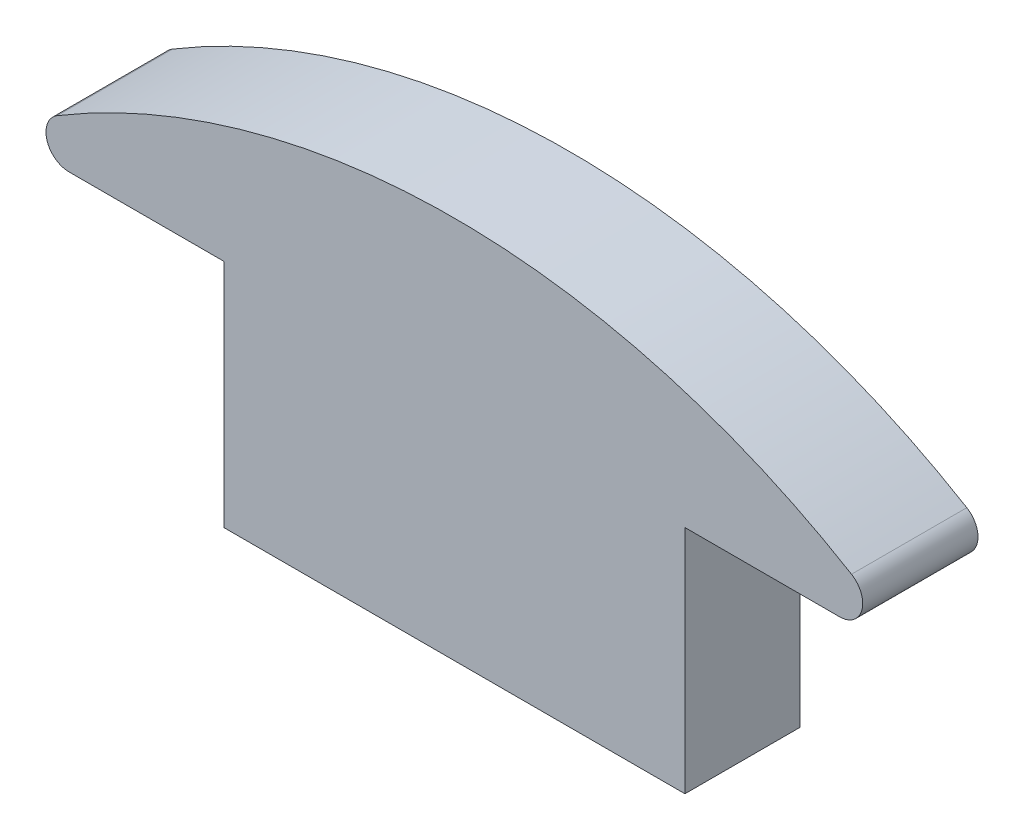
ISO-10303-21;
HEADER;
FILE_DESCRIPTION(('STEP AP214'),'2;1');
FILE_NAME('part.step','',(''),(''),'','','');
FILE_SCHEMA(('AUTOMOTIVE_DESIGN { 1 0 10303 214 1 1 1 1 }'));
ENDSEC;
DATA;
#1=APPLICATION_CONTEXT('core data for automotive mechanical design processes');
#2=APPLICATION_PROTOCOL_DEFINITION('international standard','automotive_design',2000,#1);
#3=PRODUCT_CONTEXT('',#1,'mechanical');
#4=PRODUCT('Part','Part','',(#3));
#5=PRODUCT_RELATED_PRODUCT_CATEGORY('part','',(#4));
#6=PRODUCT_DEFINITION_FORMATION('','',#4);
#7=PRODUCT_DEFINITION_CONTEXT('part definition',#1,'design');
#8=PRODUCT_DEFINITION('design','',#6,#7);
#9=PRODUCT_DEFINITION_SHAPE('','',#8);
#10=(LENGTH_UNIT() NAMED_UNIT(*) SI_UNIT(.MILLI.,.METRE.));
#11=(NAMED_UNIT(*) PLANE_ANGLE_UNIT() SI_UNIT($,.RADIAN.));
#12=(NAMED_UNIT(*) SI_UNIT($,.STERADIAN.) SOLID_ANGLE_UNIT());
#13=UNCERTAINTY_MEASURE_WITH_UNIT(LENGTH_MEASURE(1.E-05),#10,'distance_accuracy_value','');
#14=(GEOMETRIC_REPRESENTATION_CONTEXT(3) GLOBAL_UNCERTAINTY_ASSIGNED_CONTEXT((#13)) GLOBAL_UNIT_ASSIGNED_CONTEXT((#10,
#11,#12)) REPRESENTATION_CONTEXT('',''));
#15=CARTESIAN_POINT('',(0.,0.,0.));
#16=DIRECTION('',(0.,0.,1.));
#17=DIRECTION('',(1.,0.,0.));
#18=AXIS2_PLACEMENT_3D('',#15,#16,#17);
#19=CARTESIAN_POINT('',(0.,1.,0.5));
#20=DIRECTION('',(1.,0.,0.));
#21=DIRECTION('',(0.,0.,-1.));
#22=AXIS2_PLACEMENT_3D('',#19,#20,#21);
#23=PLANE('',#22);
#24=DIRECTION('',(0.,-1.,0.));
#25=VECTOR('',#24,1.);
#26=CARTESIAN_POINT('',(0.,1.,0.));
#27=LINE('',#26,#25);
#28=CARTESIAN_POINT('',(0.,1.,0.));
#29=VERTEX_POINT('',#28);
#30=CARTESIAN_POINT('',(0.,0.,0.));
#31=VERTEX_POINT('',#30);
#32=EDGE_CURVE('E128',#29,#31,#27,.T.);
#33=ORIENTED_EDGE('',*,*,#32,.T.);
#34=DIRECTION('',(0.,0.,-1.));
#35=VECTOR('',#34,1.);
#36=CARTESIAN_POINT('',(0.,0.,0.5));
#37=LINE('',#36,#35);
#38=CARTESIAN_POINT('',(0.,0.,0.5));
#39=VERTEX_POINT('',#38);
#40=EDGE_CURVE('E11',#39,#31,#37,.T.);
#41=ORIENTED_EDGE('',*,*,#40,.F.);
#42=DIRECTION('',(0.,-1.,0.));
#43=VECTOR('',#42,1.);
#44=CARTESIAN_POINT('',(0.,1.,0.5));
#45=LINE('',#44,#43);
#46=CARTESIAN_POINT('',(0.,1.,0.5));
#47=VERTEX_POINT('',#46);
#48=EDGE_CURVE('E142',#47,#39,#45,.T.);
#49=ORIENTED_EDGE('',*,*,#48,.F.);
#50=DIRECTION('',(0.,0.,-1.));
#51=VECTOR('',#50,1.);
#52=CARTESIAN_POINT('',(0.,1.,0.5));
#53=LINE('',#52,#51);
#54=EDGE_CURVE('E124',#47,#29,#53,.T.);
#55=ORIENTED_EDGE('',*,*,#54,.T.);
#56=EDGE_LOOP('',(#33,#41,#49,#55));
#57=FACE_BOUND('',#56,.T.);
#58=ADVANCED_FACE('F32',(#57),#23,.F.);
#59=CARTESIAN_POINT('',(0.,0.,0.5));
#60=DIRECTION('',(0.,1.,0.));
#61=DIRECTION('',(0.,0.,1.));
#62=AXIS2_PLACEMENT_3D('',#59,#60,#61);
#63=PLANE('',#62);
#64=DIRECTION('',(1.,0.,0.));
#65=VECTOR('',#64,1.);
#66=CARTESIAN_POINT('',(0.,0.,0.));
#67=LINE('',#66,#65);
#68=CARTESIAN_POINT('',(2.,0.,0.));
#69=VERTEX_POINT('',#68);
#70=EDGE_CURVE('E131',#31,#69,#67,.T.);
#71=ORIENTED_EDGE('',*,*,#70,.T.);
#72=DIRECTION('',(0.,0.,-1.));
#73=VECTOR('',#72,1.);
#74=CARTESIAN_POINT('',(2.,0.,0.5));
#75=LINE('',#74,#73);
#76=CARTESIAN_POINT('',(2.,0.,0.5));
#77=VERTEX_POINT('',#76);
#78=EDGE_CURVE('E40',#77,#69,#75,.T.);
#79=ORIENTED_EDGE('',*,*,#78,.F.);
#80=DIRECTION('',(1.,0.,0.));
#81=VECTOR('',#80,1.);
#82=CARTESIAN_POINT('',(0.,0.,0.5));
#83=LINE('',#82,#81);
#84=EDGE_CURVE('E91',#39,#77,#83,.T.);
#85=ORIENTED_EDGE('',*,*,#84,.F.);
#86=ORIENTED_EDGE('',*,*,#40,.T.);
#87=EDGE_LOOP('',(#71,#79,#85,#86));
#88=FACE_BOUND('',#87,.T.);
#89=ADVANCED_FACE('F177',(#88),#63,.F.);
#90=CARTESIAN_POINT('',(2.,1.,0.5));
#91=DIRECTION('',(-1.,0.,0.));
#92=DIRECTION('',(0.,0.,1.));
#93=AXIS2_PLACEMENT_3D('',#90,#91,#92);
#94=PLANE('',#93);
#95=DIRECTION('',(0.,1.,0.));
#96=VECTOR('',#95,1.);
#97=CARTESIAN_POINT('',(2.,1.,0.));
#98=LINE('',#97,#96);
#99=CARTESIAN_POINT('',(2.,1.,0.));
#100=VERTEX_POINT('',#99);
#101=EDGE_CURVE('E133',#69,#100,#98,.T.);
#102=ORIENTED_EDGE('',*,*,#101,.T.);
#103=DIRECTION('',(0.,0.,-1.));
#104=VECTOR('',#103,1.);
#105=CARTESIAN_POINT('',(2.,1.,0.5));
#106=LINE('',#105,#104);
#107=CARTESIAN_POINT('',(2.,1.,0.5));
#108=VERTEX_POINT('',#107);
#109=EDGE_CURVE('E149',#108,#100,#106,.T.);
#110=ORIENTED_EDGE('',*,*,#109,.F.);
#111=DIRECTION('',(0.,1.,0.));
#112=VECTOR('',#111,1.);
#113=CARTESIAN_POINT('',(2.,1.,0.5));
#114=LINE('',#113,#112);
#115=EDGE_CURVE('E157',#77,#108,#114,.T.);
#116=ORIENTED_EDGE('',*,*,#115,.F.);
#117=ORIENTED_EDGE('',*,*,#78,.T.);
#118=EDGE_LOOP('',(#102,#110,#116,#117));
#119=FACE_BOUND('',#118,.T.);
#120=ADVANCED_FACE('F155',(#119),#94,.F.);
#121=CARTESIAN_POINT('',(2.,1.,0.5));
#122=DIRECTION('',(0.,1.,0.));
#123=DIRECTION('',(0.,0.,1.));
#124=AXIS2_PLACEMENT_3D('',#121,#122,#123);
#125=PLANE('',#124);
#126=DIRECTION('',(1.,0.,0.));
#127=VECTOR('',#126,1.);
#128=CARTESIAN_POINT('',(2.,1.,0.));
#129=LINE('',#128,#127);
#130=CARTESIAN_POINT('',(2.67102100079534,1.,0.));
#131=VERTEX_POINT('',#130);
#132=EDGE_CURVE('E135',#100,#131,#129,.T.);
#133=ORIENTED_EDGE('',*,*,#132,.T.);
#134=DIRECTION('',(0.,0.,-1.));
#135=VECTOR('',#134,1.);
#136=CARTESIAN_POINT('',(2.67102100079534,1.,0.5));
#137=LINE('',#136,#135);
#138=CARTESIAN_POINT('',(2.67102100079534,1.,0.5));
#139=VERTEX_POINT('',#138);
#140=EDGE_CURVE('E146',#139,#131,#137,.T.);
#141=ORIENTED_EDGE('',*,*,#140,.F.);
#142=DIRECTION('',(1.,0.,0.));
#143=VECTOR('',#142,1.);
#144=CARTESIAN_POINT('',(2.,1.,0.5));
#145=LINE('',#144,#143);
#146=EDGE_CURVE('E169',#108,#139,#145,.T.);
#147=ORIENTED_EDGE('',*,*,#146,.F.);
#148=ORIENTED_EDGE('',*,*,#109,.T.);
#149=EDGE_LOOP('',(#133,#141,#147,#148));
#150=FACE_BOUND('',#149,.T.);
#151=ADVANCED_FACE('F165',(#150),#125,.F.);
#152=CARTESIAN_POINT('',(2.67102100079534,1.1,0.5));
#153=DIRECTION('',(0.,0.,-1.));
#154=DIRECTION('',(-1.,0.,0.));
#155=AXIS2_PLACEMENT_3D('',#152,#153,#154);
#156=CYLINDRICAL_SURFACE('',#155,0.0999999999999999);
#157=CARTESIAN_POINT('',(2.67102100079534,1.1,0.));
#158=DIRECTION('',(0.,0.,1.));
#159=DIRECTION('',(1.,0.,0.));
#160=AXIS2_PLACEMENT_3D('',#157,#158,#159);
#161=CIRCLE('',#160,0.0999999999999999);
#162=CARTESIAN_POINT('',(2.72243017935869,1.1857735178213,0.));
#163=VERTEX_POINT('',#162);
#164=EDGE_CURVE('E137',#131,#163,#161,.T.);
#165=ORIENTED_EDGE('',*,*,#164,.T.);
#166=DIRECTION('',(0.,0.,-1.));
#167=VECTOR('',#166,1.);
#168=CARTESIAN_POINT('',(2.72243017935869,1.1857735178213,0.5));
#169=LINE('',#168,#167);
#170=CARTESIAN_POINT('',(2.72243017935869,1.1857735178213,0.5));
#171=VERTEX_POINT('',#170);
#172=EDGE_CURVE('E119',#171,#163,#169,.T.);
#173=ORIENTED_EDGE('',*,*,#172,.F.);
#174=CARTESIAN_POINT('',(2.67102100079534,1.1,0.5));
#175=DIRECTION('',(0.,0.,1.));
#176=DIRECTION('',(1.,0.,0.));
#177=AXIS2_PLACEMENT_3D('',#174,#175,#176);
#178=CIRCLE('',#177,0.0999999999999999);
#179=EDGE_CURVE('E110',#139,#171,#178,.T.);
#180=ORIENTED_EDGE('',*,*,#179,.F.);
#181=ORIENTED_EDGE('',*,*,#140,.T.);
#182=EDGE_LOOP('',(#165,#173,#180,#181));
#183=FACE_BOUND('',#182,.T.);
#184=ADVANCED_FACE('F168',(#183),#156,.T.);
#185=CARTESIAN_POINT('',(1.,-1.68801088826708,0.5));
#186=DIRECTION('',(0.,0.,-1.));
#187=DIRECTION('',(-1.,0.,0.));
#188=AXIS2_PLACEMENT_3D('',#185,#186,#187);
#189=CYLINDRICAL_SURFACE('',#188,3.35043318623762);
#190=CARTESIAN_POINT('',(1.,-1.68801088826708,0.));
#191=DIRECTION('',(0.,0.,1.));
#192=DIRECTION('',(-1.,0.,0.));
#193=AXIS2_PLACEMENT_3D('',#190,#191,#192);
#194=CIRCLE('',#193,3.35043318623762);
#195=CARTESIAN_POINT('',(-0.722430179358692,1.1857735178213,0.));
#196=VERTEX_POINT('',#195);
#197=EDGE_CURVE('E118',#163,#196,#194,.T.);
#198=ORIENTED_EDGE('',*,*,#197,.T.);
#199=DIRECTION('',(0.,0.,-1.));
#200=VECTOR('',#199,1.);
#201=CARTESIAN_POINT('',(-0.722430179358692,1.1857735178213,0.5));
#202=LINE('',#201,#200);
#203=CARTESIAN_POINT('',(-0.722430179358692,1.1857735178213,0.5));
#204=VERTEX_POINT('',#203);
#205=EDGE_CURVE('E115',#204,#196,#202,.T.);
#206=ORIENTED_EDGE('',*,*,#205,.F.);
#207=CARTESIAN_POINT('',(1.,-1.68801088826708,0.5));
#208=DIRECTION('',(0.,0.,1.));
#209=DIRECTION('',(-1.,0.,0.));
#210=AXIS2_PLACEMENT_3D('',#207,#208,#209);
#211=CIRCLE('',#210,3.35043318623762);
#212=EDGE_CURVE('E104',#171,#204,#211,.T.);
#213=ORIENTED_EDGE('',*,*,#212,.F.);
#214=ORIENTED_EDGE('',*,*,#172,.T.);
#215=EDGE_LOOP('',(#198,#206,#213,#214));
#216=FACE_BOUND('',#215,.T.);
#217=ADVANCED_FACE('F116',(#216),#189,.T.);
#218=CARTESIAN_POINT('',(-0.67102100079534,1.1,0.5));
#219=DIRECTION('',(0.,0.,-1.));
#220=DIRECTION('',(-1.,0.,0.));
#221=AXIS2_PLACEMENT_3D('',#218,#219,#220);
#222=CYLINDRICAL_SURFACE('',#221,0.0999999999999997);
#223=CARTESIAN_POINT('',(-0.67102100079534,1.1,0.));
#224=DIRECTION('',(0.,0.,1.));
#225=DIRECTION('',(-1.,0.,0.));
#226=AXIS2_PLACEMENT_3D('',#223,#224,#225);
#227=CIRCLE('',#226,0.0999999999999997);
#228=CARTESIAN_POINT('',(-0.67102100079534,1.,0.));
#229=VERTEX_POINT('',#228);
#230=EDGE_CURVE('E77',#196,#229,#227,.T.);
#231=ORIENTED_EDGE('',*,*,#230,.T.);
#232=DIRECTION('',(0.,0.,-1.));
#233=VECTOR('',#232,1.);
#234=CARTESIAN_POINT('',(-0.67102100079534,1.,0.5));
#235=LINE('',#234,#233);
#236=CARTESIAN_POINT('',(-0.67102100079534,1.,0.5));
#237=VERTEX_POINT('',#236);
#238=EDGE_CURVE('E120',#237,#229,#235,.T.);
#239=ORIENTED_EDGE('',*,*,#238,.F.);
#240=CARTESIAN_POINT('',(-0.67102100079534,1.1,0.5));
#241=DIRECTION('',(0.,0.,1.));
#242=DIRECTION('',(-1.,0.,0.));
#243=AXIS2_PLACEMENT_3D('',#240,#241,#242);
#244=CIRCLE('',#243,0.0999999999999997);
#245=EDGE_CURVE('E108',#204,#237,#244,.T.);
#246=ORIENTED_EDGE('',*,*,#245,.F.);
#247=ORIENTED_EDGE('',*,*,#205,.T.);
#248=EDGE_LOOP('',(#231,#239,#246,#247));
#249=FACE_BOUND('',#248,.T.);
#250=ADVANCED_FACE('F122',(#249),#222,.T.);
#251=CARTESIAN_POINT('',(0.,1.,0.5));
#252=DIRECTION('',(0.,1.,0.));
#253=DIRECTION('',(-1.,0.,0.));
#254=AXIS2_PLACEMENT_3D('',#251,#252,#253);
#255=PLANE('',#254);
#256=DIRECTION('',(1.,0.,0.));
#257=VECTOR('',#256,1.);
#258=CARTESIAN_POINT('',(0.,1.,0.));
#259=LINE('',#258,#257);
#260=EDGE_CURVE('E83',#229,#29,#259,.T.);
#261=ORIENTED_EDGE('',*,*,#260,.T.);
#262=ORIENTED_EDGE('',*,*,#54,.F.);
#263=DIRECTION('',(1.,0.,0.));
#264=VECTOR('',#263,1.);
#265=CARTESIAN_POINT('',(0.,1.,0.5));
#266=LINE('',#265,#264);
#267=EDGE_CURVE('E48',#237,#47,#266,.T.);
#268=ORIENTED_EDGE('',*,*,#267,.F.);
#269=ORIENTED_EDGE('',*,*,#238,.T.);
#270=EDGE_LOOP('',(#261,#262,#268,#269));
#271=FACE_BOUND('',#270,.T.);
#272=ADVANCED_FACE('F193',(#271),#255,.F.);
#273=CARTESIAN_POINT('',(2.67102100079534,1.1,0.5));
#274=DIRECTION('',(0.,0.,1.));
#275=DIRECTION('',(1.,0.,0.));
#276=AXIS2_PLACEMENT_3D('',#273,#274,#275);
#277=PLANE('',#276);
#278=ORIENTED_EDGE('',*,*,#48,.T.);
#279=ORIENTED_EDGE('',*,*,#84,.T.);
#280=ORIENTED_EDGE('',*,*,#115,.T.);
#281=ORIENTED_EDGE('',*,*,#146,.T.);
#282=ORIENTED_EDGE('',*,*,#179,.T.);
#283=ORIENTED_EDGE('',*,*,#212,.T.);
#284=ORIENTED_EDGE('',*,*,#245,.T.);
#285=ORIENTED_EDGE('',*,*,#267,.T.);
#286=EDGE_LOOP('',(#278,#279,#280,#281,#282,#283,#284,#285));
#287=FACE_BOUND('',#286,.T.);
#288=ADVANCED_FACE('F106',(#287),#277,.T.);
#289=CARTESIAN_POINT('',(2.67102100079534,1.1,0.));
#290=DIRECTION('',(0.,0.,1.));
#291=DIRECTION('',(1.,0.,0.));
#292=AXIS2_PLACEMENT_3D('',#289,#290,#291);
#293=PLANE('',#292);
#294=ORIENTED_EDGE('',*,*,#32,.F.);
#295=ORIENTED_EDGE('',*,*,#260,.F.);
#296=ORIENTED_EDGE('',*,*,#230,.F.);
#297=ORIENTED_EDGE('',*,*,#197,.F.);
#298=ORIENTED_EDGE('',*,*,#164,.F.);
#299=ORIENTED_EDGE('',*,*,#132,.F.);
#300=ORIENTED_EDGE('',*,*,#101,.F.);
#301=ORIENTED_EDGE('',*,*,#70,.F.);
#302=EDGE_LOOP('',(#294,#295,#296,#297,#298,#299,#300,#301));
#303=FACE_BOUND('',#302,.T.);
#304=ADVANCED_FACE('F161',(#303),#293,.F.);
#305=CLOSED_SHELL('',(#58,#89,#120,#151,#184,#217,#250,#272,#288,#304));
#306=MANIFOLD_SOLID_BREP('B2',#305);
#307=ADVANCED_BREP_SHAPE_REPRESENTATION('',(#18,#306),#14);
#308=SHAPE_DEFINITION_REPRESENTATION(#9,#307);
ENDSEC;
END-ISO-10303-21;
